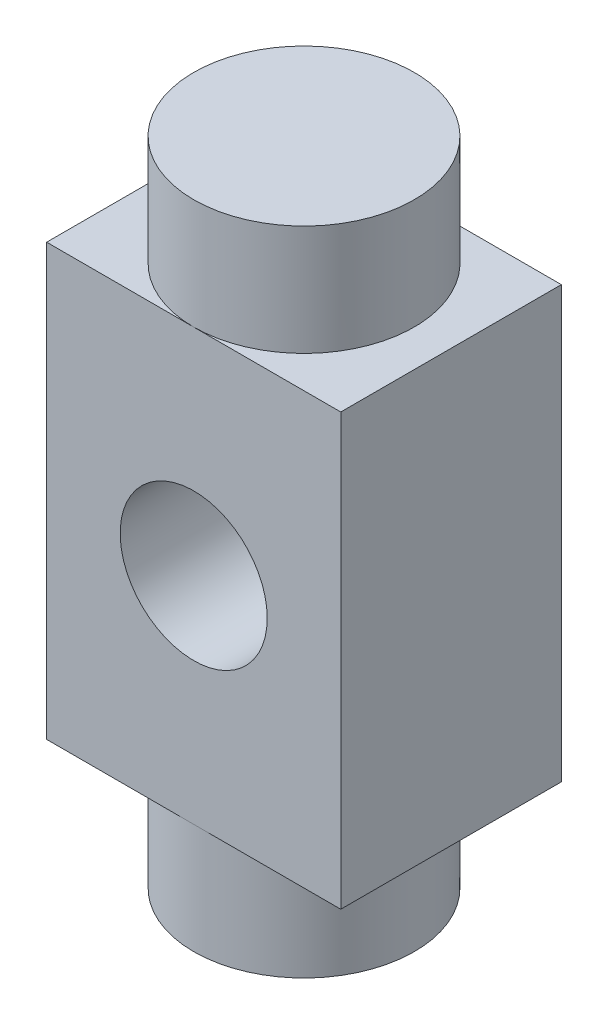
ISO-10303-21;
HEADER;
FILE_DESCRIPTION(('STEP AP214'),'2;1');
FILE_NAME('part.step','',(''),(''),'','','');
FILE_SCHEMA(('AUTOMOTIVE_DESIGN { 1 0 10303 214 1 1 1 1 }'));
ENDSEC;
DATA;
#1=APPLICATION_CONTEXT('core data for automotive mechanical design processes');
#2=APPLICATION_PROTOCOL_DEFINITION('international standard','automotive_design',2000,#1);
#3=PRODUCT_CONTEXT('',#1,'mechanical');
#4=PRODUCT('Part','Part','',(#3));
#5=PRODUCT_RELATED_PRODUCT_CATEGORY('part','',(#4));
#6=PRODUCT_DEFINITION_FORMATION('','',#4);
#7=PRODUCT_DEFINITION_CONTEXT('part definition',#1,'design');
#8=PRODUCT_DEFINITION('design','',#6,#7);
#9=PRODUCT_DEFINITION_SHAPE('','',#8);
#10=(LENGTH_UNIT() NAMED_UNIT(*) SI_UNIT(.MILLI.,.METRE.));
#11=(NAMED_UNIT(*) PLANE_ANGLE_UNIT() SI_UNIT($,.RADIAN.));
#12=(NAMED_UNIT(*) SI_UNIT($,.STERADIAN.) SOLID_ANGLE_UNIT());
#13=UNCERTAINTY_MEASURE_WITH_UNIT(LENGTH_MEASURE(1.E-05),#10,'distance_accuracy_value','');
#14=(GEOMETRIC_REPRESENTATION_CONTEXT(3) GLOBAL_UNCERTAINTY_ASSIGNED_CONTEXT((#13)) GLOBAL_UNIT_ASSIGNED_CONTEXT((#10,
#11,#12)) REPRESENTATION_CONTEXT('',''));
#15=CARTESIAN_POINT('',(0.,0.,0.));
#16=DIRECTION('',(0.,0.,1.));
#17=DIRECTION('',(1.,0.,0.));
#18=AXIS2_PLACEMENT_3D('',#15,#16,#17);
#19=CARTESIAN_POINT('',(2.,-2.92844438552856,3.));
#20=DIRECTION('',(0.,1.,0.));
#21=DIRECTION('',(0.,0.,1.));
#22=AXIS2_PLACEMENT_3D('',#19,#20,#21);
#23=PLANE('',#22);
#24=DIRECTION('',(1.,0.,0.));
#25=VECTOR('',#24,1.);
#26=CARTESIAN_POINT('',(2.,-2.92844438552856,3.));
#27=LINE('',#26,#25);
#28=CARTESIAN_POINT('',(0.,-2.92844438552856,3.));
#29=VERTEX_POINT('',#28);
#30=CARTESIAN_POINT('',(2.,-2.92844438552856,3.));
#31=VERTEX_POINT('',#30);
#32=EDGE_CURVE('E100',#29,#31,#27,.T.);
#33=ORIENTED_EDGE('',*,*,#32,.F.);
#34=CARTESIAN_POINT('',(0.,-2.92844438552856,1.5));
#35=DIRECTION('',(0.,1.,0.));
#36=DIRECTION('',(0.,0.,1.));
#37=AXIS2_PLACEMENT_3D('',#34,#35,#36);
#38=CIRCLE('',#37,1.5);
#39=CARTESIAN_POINT('',(0.,-2.92844438552856,0.));
#40=VERTEX_POINT('',#39);
#41=EDGE_CURVE('E51',#29,#40,#38,.T.);
#42=ORIENTED_EDGE('',*,*,#41,.T.);
#43=DIRECTION('',(1.,0.,0.));
#44=VECTOR('',#43,1.);
#45=CARTESIAN_POINT('',(2.,-2.92844438552856,0.));
#46=LINE('',#45,#44);
#47=CARTESIAN_POINT('',(2.,-2.92844438552856,0.));
#48=VERTEX_POINT('',#47);
#49=EDGE_CURVE('E98',#40,#48,#46,.T.);
#50=ORIENTED_EDGE('',*,*,#49,.T.);
#51=DIRECTION('',(0.,0.,-1.));
#52=VECTOR('',#51,1.);
#53=CARTESIAN_POINT('',(2.,-2.92844438552856,3.));
#54=LINE('',#53,#52);
#55=EDGE_CURVE('E139',#31,#48,#54,.T.);
#56=ORIENTED_EDGE('',*,*,#55,.F.);
#57=EDGE_LOOP('',(#33,#42,#50,#56));
#58=FACE_BOUND('',#57,.T.);
#59=ADVANCED_FACE('F39',(#58),#23,.F.);
#60=CARTESIAN_POINT('',(-2.,2.92844438552856,3.));
#61=DIRECTION('',(0.,-1.,0.));
#62=DIRECTION('',(0.,0.,-1.));
#63=AXIS2_PLACEMENT_3D('',#60,#61,#62);
#64=PLANE('',#63);
#65=CARTESIAN_POINT('',(0.,2.92844438552856,1.5));
#66=DIRECTION('',(0.,1.,0.));
#67=DIRECTION('',(0.,0.,1.));
#68=AXIS2_PLACEMENT_3D('',#65,#66,#67);
#69=CIRCLE('',#68,1.5);
#70=CARTESIAN_POINT('',(0.,2.92844438552856,3.));
#71=VERTEX_POINT('',#70);
#72=CARTESIAN_POINT('',(0.,2.92844438552856,0.));
#73=VERTEX_POINT('',#72);
#74=EDGE_CURVE('E146',#71,#73,#69,.T.);
#75=ORIENTED_EDGE('',*,*,#74,.F.);
#76=DIRECTION('',(-1.,0.,0.));
#77=VECTOR('',#76,1.);
#78=CARTESIAN_POINT('',(-2.,2.92844438552856,3.));
#79=LINE('',#78,#77);
#80=CARTESIAN_POINT('',(2.,2.92844438552856,3.));
#81=VERTEX_POINT('',#80);
#82=EDGE_CURVE('E136',#81,#71,#79,.T.);
#83=ORIENTED_EDGE('',*,*,#82,.F.);
#84=DIRECTION('',(0.,0.,-1.));
#85=VECTOR('',#84,1.);
#86=CARTESIAN_POINT('',(2.,2.92844438552856,3.));
#87=LINE('',#86,#85);
#88=CARTESIAN_POINT('',(2.,2.92844438552856,0.));
#89=VERTEX_POINT('',#88);
#90=EDGE_CURVE('E135',#81,#89,#87,.T.);
#91=ORIENTED_EDGE('',*,*,#90,.T.);
#92=DIRECTION('',(-1.,0.,0.));
#93=VECTOR('',#92,1.);
#94=CARTESIAN_POINT('',(-2.,2.92844438552856,0.));
#95=LINE('',#94,#93);
#96=EDGE_CURVE('E126',#89,#73,#95,.T.);
#97=ORIENTED_EDGE('',*,*,#96,.T.);
#98=EDGE_LOOP('',(#75,#83,#91,#97));
#99=FACE_BOUND('',#98,.T.);
#100=ADVANCED_FACE('F172',(#99),#64,.F.);
#101=CARTESIAN_POINT('',(0.,0.,3.));
#102=DIRECTION('',(0.,0.,-1.));
#103=DIRECTION('',(-1.,0.,0.));
#104=AXIS2_PLACEMENT_3D('',#101,#102,#103);
#105=PLANE('',#104);
#106=DIRECTION('',(0.,-1.,0.));
#107=VECTOR('',#106,1.);
#108=CARTESIAN_POINT('',(-2.,-2.92844438552856,3.));
#109=LINE('',#108,#107);
#110=CARTESIAN_POINT('',(-2.,2.92844438552856,3.));
#111=VERTEX_POINT('',#110);
#112=CARTESIAN_POINT('',(-2.,-2.92844438552856,3.));
#113=VERTEX_POINT('',#112);
#114=EDGE_CURVE('E130',#111,#113,#109,.T.);
#115=ORIENTED_EDGE('',*,*,#114,.T.);
#116=EDGE_CURVE('E207',#113,#29,#27,.T.);
#117=ORIENTED_EDGE('',*,*,#116,.T.);
#118=ORIENTED_EDGE('',*,*,#32,.T.);
#119=DIRECTION('',(0.,1.,0.));
#120=VECTOR('',#119,1.);
#121=CARTESIAN_POINT('',(2.,2.92844438552856,3.));
#122=LINE('',#121,#120);
#123=EDGE_CURVE('E210',#31,#81,#122,.T.);
#124=ORIENTED_EDGE('',*,*,#123,.T.);
#125=ORIENTED_EDGE('',*,*,#82,.T.);
#126=EDGE_CURVE('E212',#71,#111,#79,.T.);
#127=ORIENTED_EDGE('',*,*,#126,.T.);
#128=EDGE_LOOP('',(#115,#117,#118,#124,#125,#127));
#129=FACE_BOUND('',#128,.T.);
#130=CARTESIAN_POINT('',(0.,0.,3.));
#131=DIRECTION('',(0.,0.,1.));
#132=DIRECTION('',(1.,0.,0.));
#133=AXIS2_PLACEMENT_3D('',#130,#131,#132);
#134=CIRCLE('',#133,0.999999985003166);
#135=CARTESIAN_POINT('',(0.999999985003166,0.,3.));
#136=VERTEX_POINT('',#135);
#137=EDGE_CURVE('E195',#136,#136,#134,.T.);
#138=ORIENTED_EDGE('',*,*,#137,.F.);
#139=EDGE_LOOP('',(#138));
#140=FACE_BOUND('',#139,.T.);
#141=ADVANCED_FACE('F176',(#129,#140),#105,.F.);
#142=CARTESIAN_POINT('',(0.,0.,0.));
#143=DIRECTION('',(0.,0.,-1.));
#144=DIRECTION('',(-1.,0.,0.));
#145=AXIS2_PLACEMENT_3D('',#142,#143,#144);
#146=PLANE('',#145);
#147=DIRECTION('',(0.,-1.,0.));
#148=VECTOR('',#147,1.);
#149=CARTESIAN_POINT('',(-2.,-2.92844438552856,0.));
#150=LINE('',#149,#148);
#151=CARTESIAN_POINT('',(-2.,2.92844438552856,0.));
#152=VERTEX_POINT('',#151);
#153=CARTESIAN_POINT('',(-2.,-2.92844438552856,0.));
#154=VERTEX_POINT('',#153);
#155=EDGE_CURVE('E114',#152,#154,#150,.T.);
#156=ORIENTED_EDGE('',*,*,#155,.F.);
#157=EDGE_CURVE('E121',#73,#152,#95,.T.);
#158=ORIENTED_EDGE('',*,*,#157,.F.);
#159=ORIENTED_EDGE('',*,*,#96,.F.);
#160=DIRECTION('',(0.,1.,0.));
#161=VECTOR('',#160,1.);
#162=CARTESIAN_POINT('',(2.,2.92844438552856,0.));
#163=LINE('',#162,#161);
#164=EDGE_CURVE('E112',#48,#89,#163,.T.);
#165=ORIENTED_EDGE('',*,*,#164,.F.);
#166=ORIENTED_EDGE('',*,*,#49,.F.);
#167=EDGE_CURVE('E109',#154,#40,#46,.T.);
#168=ORIENTED_EDGE('',*,*,#167,.F.);
#169=EDGE_LOOP('',(#156,#158,#159,#165,#166,#168));
#170=FACE_BOUND('',#169,.T.);
#171=CARTESIAN_POINT('',(0.,0.,0.));
#172=DIRECTION('',(0.,0.,1.));
#173=DIRECTION('',(1.,0.,0.));
#174=AXIS2_PLACEMENT_3D('',#171,#172,#173);
#175=CIRCLE('',#174,0.999999985003166);
#176=CARTESIAN_POINT('',(0.999999985003166,0.,0.));
#177=VERTEX_POINT('',#176);
#178=EDGE_CURVE('E157',#177,#177,#175,.T.);
#179=ORIENTED_EDGE('',*,*,#178,.T.);
#180=EDGE_LOOP('',(#179));
#181=FACE_BOUND('',#180,.T.);
#182=ADVANCED_FACE('F107',(#170,#181),#146,.T.);
#183=CARTESIAN_POINT('',(-2.,-2.92844438552856,3.));
#184=DIRECTION('',(1.,0.,0.));
#185=DIRECTION('',(0.,0.,-1.));
#186=AXIS2_PLACEMENT_3D('',#183,#184,#185);
#187=PLANE('',#186);
#188=ORIENTED_EDGE('',*,*,#155,.T.);
#189=DIRECTION('',(0.,0.,-1.));
#190=VECTOR('',#189,1.);
#191=CARTESIAN_POINT('',(-2.,-2.92844438552856,3.));
#192=LINE('',#191,#190);
#193=EDGE_CURVE('E43',#113,#154,#192,.T.);
#194=ORIENTED_EDGE('',*,*,#193,.F.);
#195=ORIENTED_EDGE('',*,*,#114,.F.);
#196=DIRECTION('',(0.,0.,-1.));
#197=VECTOR('',#196,1.);
#198=CARTESIAN_POINT('',(-2.,2.92844438552856,3.));
#199=LINE('',#198,#197);
#200=EDGE_CURVE('E131',#111,#152,#199,.T.);
#201=ORIENTED_EDGE('',*,*,#200,.T.);
#202=EDGE_LOOP('',(#188,#194,#195,#201));
#203=FACE_BOUND('',#202,.T.);
#204=ADVANCED_FACE('F41',(#203),#187,.F.);
#205=ORIENTED_EDGE('',*,*,#167,.T.);
#206=EDGE_CURVE('E11',#40,#29,#38,.T.);
#207=ORIENTED_EDGE('',*,*,#206,.T.);
#208=ORIENTED_EDGE('',*,*,#116,.F.);
#209=ORIENTED_EDGE('',*,*,#193,.T.);
#210=EDGE_LOOP('',(#205,#207,#208,#209));
#211=FACE_BOUND('',#210,.T.);
#212=ADVANCED_FACE('F116',(#211),#23,.F.);
#213=CARTESIAN_POINT('',(2.,2.92844438552856,3.));
#214=DIRECTION('',(-1.,0.,0.));
#215=DIRECTION('',(0.,0.,1.));
#216=AXIS2_PLACEMENT_3D('',#213,#214,#215);
#217=PLANE('',#216);
#218=ORIENTED_EDGE('',*,*,#164,.T.);
#219=ORIENTED_EDGE('',*,*,#90,.F.);
#220=ORIENTED_EDGE('',*,*,#123,.F.);
#221=ORIENTED_EDGE('',*,*,#55,.T.);
#222=EDGE_LOOP('',(#218,#219,#220,#221));
#223=FACE_BOUND('',#222,.T.);
#224=ADVANCED_FACE('F182',(#223),#217,.F.);
#225=EDGE_CURVE('E49',#73,#71,#69,.T.);
#226=ORIENTED_EDGE('',*,*,#225,.F.);
#227=ORIENTED_EDGE('',*,*,#157,.T.);
#228=ORIENTED_EDGE('',*,*,#200,.F.);
#229=ORIENTED_EDGE('',*,*,#126,.F.);
#230=EDGE_LOOP('',(#226,#227,#228,#229));
#231=FACE_BOUND('',#230,.T.);
#232=ADVANCED_FACE('F179',(#231),#64,.F.);
#233=CARTESIAN_POINT('',(0.,0.,3.));
#234=DIRECTION('',(0.,0.,-1.));
#235=DIRECTION('',(-1.,0.,0.));
#236=AXIS2_PLACEMENT_3D('',#233,#234,#235);
#237=CYLINDRICAL_SURFACE('',#236,0.999999985003166);
#238=ORIENTED_EDGE('',*,*,#137,.T.);
#239=EDGE_LOOP('',(#238));
#240=FACE_BOUND('',#239,.T.);
#241=ORIENTED_EDGE('',*,*,#178,.F.);
#242=EDGE_LOOP('',(#241));
#243=FACE_BOUND('',#242,.T.);
#244=ADVANCED_FACE('F222',(#240,#243),#237,.F.);
#245=CARTESIAN_POINT('',(0.,4.42844438552856,1.5));
#246=DIRECTION('',(0.,-1.,0.));
#247=DIRECTION('',(0.,0.,-1.));
#248=AXIS2_PLACEMENT_3D('',#245,#246,#247);
#249=CYLINDRICAL_SURFACE('',#248,1.5);
#250=CARTESIAN_POINT('',(0.,4.42844438552856,1.5));
#251=DIRECTION('',(0.,1.,0.));
#252=DIRECTION('',(0.,0.,1.));
#253=AXIS2_PLACEMENT_3D('',#250,#251,#252);
#254=CIRCLE('',#253,1.5);
#255=CARTESIAN_POINT('',(0.,4.42844438552856,3.));
#256=VERTEX_POINT('',#255);
#257=EDGE_CURVE('E152',#256,#256,#254,.T.);
#258=ORIENTED_EDGE('',*,*,#257,.F.);
#259=EDGE_LOOP('',(#258));
#260=FACE_BOUND('',#259,.T.);
#261=ORIENTED_EDGE('',*,*,#74,.T.);
#262=ORIENTED_EDGE('',*,*,#225,.T.);
#263=EDGE_LOOP('',(#261,#262));
#264=FACE_BOUND('',#263,.T.);
#265=ADVANCED_FACE('F226',(#260,#264),#249,.T.);
#266=CARTESIAN_POINT('',(0.,4.42844438552856,1.5));
#267=DIRECTION('',(0.,1.,0.));
#268=DIRECTION('',(0.,0.,1.));
#269=AXIS2_PLACEMENT_3D('',#266,#267,#268);
#270=PLANE('',#269);
#271=ORIENTED_EDGE('',*,*,#257,.T.);
#272=EDGE_LOOP('',(#271));
#273=FACE_BOUND('',#272,.T.);
#274=ADVANCED_FACE('F169',(#273),#270,.T.);
#275=CARTESIAN_POINT('',(0.,-4.42844438552856,1.5));
#276=DIRECTION('',(0.,1.,0.));
#277=DIRECTION('',(0.,0.,1.));
#278=AXIS2_PLACEMENT_3D('',#275,#276,#277);
#279=CYLINDRICAL_SURFACE('',#278,1.5);
#280=CARTESIAN_POINT('',(0.,-4.42844438552856,1.5));
#281=DIRECTION('',(0.,1.,0.));
#282=DIRECTION('',(0.,0.,1.));
#283=AXIS2_PLACEMENT_3D('',#280,#281,#282);
#284=CIRCLE('',#283,1.5);
#285=CARTESIAN_POINT('',(0.,-4.42844438552856,3.));
#286=VERTEX_POINT('',#285);
#287=EDGE_CURVE('E103',#286,#286,#284,.T.);
#288=ORIENTED_EDGE('',*,*,#287,.T.);
#289=EDGE_LOOP('',(#288));
#290=FACE_BOUND('',#289,.T.);
#291=ORIENTED_EDGE('',*,*,#41,.F.);
#292=ORIENTED_EDGE('',*,*,#206,.F.);
#293=EDGE_LOOP('',(#291,#292));
#294=FACE_BOUND('',#293,.T.);
#295=ADVANCED_FACE('F91',(#290,#294),#279,.T.);
#296=CARTESIAN_POINT('',(0.,-4.42844438552856,1.5));
#297=DIRECTION('',(0.,-1.,0.));
#298=DIRECTION('',(0.,0.,1.));
#299=AXIS2_PLACEMENT_3D('',#296,#297,#298);
#300=PLANE('',#299);
#301=ORIENTED_EDGE('',*,*,#287,.F.);
#302=EDGE_LOOP('',(#301));
#303=FACE_BOUND('',#302,.T.);
#304=ADVANCED_FACE('F163',(#303),#300,.T.);
#305=CLOSED_SHELL('',(#59,#100,#141,#182,#204,#212,#224,#232,#244,#265,#274,#295,#304));
#306=MANIFOLD_SOLID_BREP('B2',#305);
#307=ADVANCED_BREP_SHAPE_REPRESENTATION('',(#18,#306),#14);
#308=SHAPE_DEFINITION_REPRESENTATION(#9,#307);
ENDSEC;
END-ISO-10303-21;
